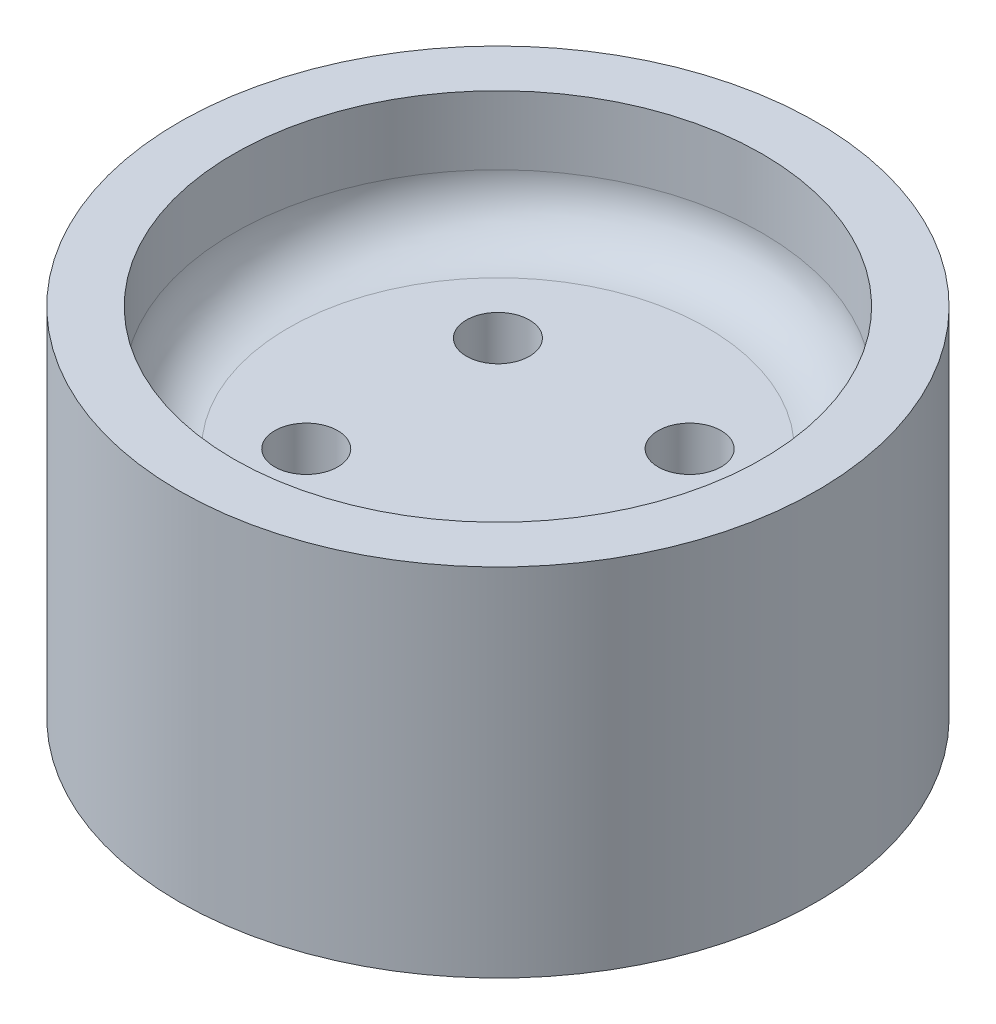
ISO-10303-21;
HEADER;
FILE_DESCRIPTION(('STEP AP214'),'2;1');
FILE_NAME('part.step','',(''),(''),'','','');
FILE_SCHEMA(('AUTOMOTIVE_DESIGN { 1 0 10303 214 1 1 1 1 }'));
ENDSEC;
DATA;
#1=APPLICATION_CONTEXT('core data for automotive mechanical design processes');
#2=APPLICATION_PROTOCOL_DEFINITION('international standard','automotive_design',2000,#1);
#3=PRODUCT_CONTEXT('',#1,'mechanical');
#4=PRODUCT('Part','Part','',(#3));
#5=PRODUCT_RELATED_PRODUCT_CATEGORY('part','',(#4));
#6=PRODUCT_DEFINITION_FORMATION('','',#4);
#7=PRODUCT_DEFINITION_CONTEXT('part definition',#1,'design');
#8=PRODUCT_DEFINITION('design','',#6,#7);
#9=PRODUCT_DEFINITION_SHAPE('','',#8);
#10=(LENGTH_UNIT() NAMED_UNIT(*) SI_UNIT(.MILLI.,.METRE.));
#11=(NAMED_UNIT(*) PLANE_ANGLE_UNIT() SI_UNIT($,.RADIAN.));
#12=(NAMED_UNIT(*) SI_UNIT($,.STERADIAN.) SOLID_ANGLE_UNIT());
#13=UNCERTAINTY_MEASURE_WITH_UNIT(LENGTH_MEASURE(1.E-05),#10,'distance_accuracy_value','');
#14=(GEOMETRIC_REPRESENTATION_CONTEXT(3) GLOBAL_UNCERTAINTY_ASSIGNED_CONTEXT((#13)) GLOBAL_UNIT_ASSIGNED_CONTEXT((#10,
#11,#12)) REPRESENTATION_CONTEXT('',''));
#15=CARTESIAN_POINT('',(0.,0.,0.));
#16=DIRECTION('',(0.,0.,1.));
#17=DIRECTION('',(1.,0.,0.));
#18=AXIS2_PLACEMENT_3D('',#15,#16,#17);
#19=CARTESIAN_POINT('',(0.,8.5,0.));
#20=DIRECTION('',(0.,1.,0.));
#21=DIRECTION('',(0.,0.,1.));
#22=AXIS2_PLACEMENT_3D('',#19,#20,#21);
#23=PLANE('',#22);
#24=CARTESIAN_POINT('',(0.,8.5,0.));
#25=DIRECTION('',(0.,1.,0.));
#26=DIRECTION('',(0.,0.,1.));
#27=AXIS2_PLACEMENT_3D('',#24,#25,#26);
#28=CIRCLE('',#27,7.65);
#29=CARTESIAN_POINT('',(0.,8.5,7.65));
#30=VERTEX_POINT('',#29);
#31=EDGE_CURVE('E10',#30,#30,#28,.T.);
#32=ORIENTED_EDGE('',*,*,#31,.T.);
#33=EDGE_LOOP('',(#32));
#34=FACE_BOUND('',#33,.T.);
#35=CARTESIAN_POINT('',(-3.4999999999998,8.5,3.5));
#36=DIRECTION('',(0.,1.,0.));
#37=DIRECTION('',(0.,0.,1.));
#38=AXIS2_PLACEMENT_3D('',#35,#36,#37);
#39=CIRCLE('',#38,1.1500000000001);
#40=CARTESIAN_POINT('',(-3.4999999999998,8.5,4.6500000000001));
#41=VERTEX_POINT('',#40);
#42=EDGE_CURVE('E45',#41,#41,#39,.T.);
#43=ORIENTED_EDGE('',*,*,#42,.F.);
#44=EDGE_LOOP('',(#43));
#45=FACE_BOUND('',#44,.T.);
#46=CARTESIAN_POINT('',(3.5000000000002,8.5,3.4999999999998));
#47=DIRECTION('',(0.,1.,0.));
#48=DIRECTION('',(0.,0.,1.));
#49=AXIS2_PLACEMENT_3D('',#46,#47,#48);
#50=CIRCLE('',#49,1.15000000000028);
#51=CARTESIAN_POINT('',(3.5000000000002,8.5,4.65000000000008));
#52=VERTEX_POINT('',#51);
#53=EDGE_CURVE('E49',#52,#52,#50,.T.);
#54=ORIENTED_EDGE('',*,*,#53,.F.);
#55=EDGE_LOOP('',(#54));
#56=FACE_BOUND('',#55,.T.);
#57=CARTESIAN_POINT('',(3.5,8.5,-3.5000000000002));
#58=DIRECTION('',(0.,1.,0.));
#59=DIRECTION('',(0.,0.,1.));
#60=AXIS2_PLACEMENT_3D('',#57,#58,#59);
#61=CIRCLE('',#60,1.1500000000002);
#62=CARTESIAN_POINT('',(3.5,8.5,-2.34999999999999));
#63=VERTEX_POINT('',#62);
#64=EDGE_CURVE('E71',#63,#63,#61,.T.);
#65=ORIENTED_EDGE('',*,*,#64,.F.);
#66=EDGE_LOOP('',(#65));
#67=FACE_BOUND('',#66,.T.);
#68=CARTESIAN_POINT('',(-3.5,8.5,-3.5));
#69=DIRECTION('',(0.,1.,0.));
#70=DIRECTION('',(0.,0.,1.));
#71=AXIS2_PLACEMENT_3D('',#68,#69,#70);
#72=CIRCLE('',#71,1.15);
#73=CARTESIAN_POINT('',(-3.5,8.5,-2.35));
#74=VERTEX_POINT('',#73);
#75=EDGE_CURVE('E55',#74,#74,#72,.T.);
#76=ORIENTED_EDGE('',*,*,#75,.F.);
#77=EDGE_LOOP('',(#76));
#78=FACE_BOUND('',#77,.T.);
#79=ADVANCED_FACE('F34',(#34,#45,#56,#67,#78),#23,.T.);
#80=CARTESIAN_POINT('',(-3.4999999999998,8.5,3.5));
#81=DIRECTION('',(0.,-1.,0.));
#82=DIRECTION('',(0.,0.,-1.));
#83=AXIS2_PLACEMENT_3D('',#80,#81,#82);
#84=CYLINDRICAL_SURFACE('',#83,1.1500000000001);
#85=ORIENTED_EDGE('',*,*,#42,.T.);
#86=EDGE_LOOP('',(#85));
#87=FACE_BOUND('',#86,.T.);
#88=CARTESIAN_POINT('',(-3.4999999999998,0.,3.5));
#89=DIRECTION('',(0.,1.,0.));
#90=DIRECTION('',(0.,0.,1.));
#91=AXIS2_PLACEMENT_3D('',#88,#89,#90);
#92=CIRCLE('',#91,1.1500000000001);
#93=CARTESIAN_POINT('',(-3.4999999999998,0.,4.6500000000001));
#94=VERTEX_POINT('',#93);
#95=EDGE_CURVE('E56',#94,#94,#92,.T.);
#96=ORIENTED_EDGE('',*,*,#95,.F.);
#97=EDGE_LOOP('',(#96));
#98=FACE_BOUND('',#97,.T.);
#99=ADVANCED_FACE('F99',(#87,#98),#84,.F.);
#100=CARTESIAN_POINT('',(3.5000000000002,8.5,3.4999999999998));
#101=DIRECTION('',(0.,-1.,0.));
#102=DIRECTION('',(0.,0.,-1.));
#103=AXIS2_PLACEMENT_3D('',#100,#101,#102);
#104=CYLINDRICAL_SURFACE('',#103,1.15000000000028);
#105=ORIENTED_EDGE('',*,*,#53,.T.);
#106=EDGE_LOOP('',(#105));
#107=FACE_BOUND('',#106,.T.);
#108=CARTESIAN_POINT('',(3.5000000000002,0.,3.4999999999998));
#109=DIRECTION('',(0.,1.,0.));
#110=DIRECTION('',(0.,0.,1.));
#111=AXIS2_PLACEMENT_3D('',#108,#109,#110);
#112=CIRCLE('',#111,1.15000000000028);
#113=CARTESIAN_POINT('',(3.5000000000002,0.,4.65000000000008));
#114=VERTEX_POINT('',#113);
#115=EDGE_CURVE('E59',#114,#114,#112,.T.);
#116=ORIENTED_EDGE('',*,*,#115,.F.);
#117=EDGE_LOOP('',(#116));
#118=FACE_BOUND('',#117,.T.);
#119=ADVANCED_FACE('F103',(#107,#118),#104,.F.);
#120=CARTESIAN_POINT('',(3.5,8.5,-3.5000000000002));
#121=DIRECTION('',(0.,-1.,0.));
#122=DIRECTION('',(0.,0.,-1.));
#123=AXIS2_PLACEMENT_3D('',#120,#121,#122);
#124=CYLINDRICAL_SURFACE('',#123,1.1500000000002);
#125=ORIENTED_EDGE('',*,*,#64,.T.);
#126=EDGE_LOOP('',(#125));
#127=FACE_BOUND('',#126,.T.);
#128=CARTESIAN_POINT('',(3.5,0.,-3.5000000000002));
#129=DIRECTION('',(0.,1.,0.));
#130=DIRECTION('',(0.,0.,1.));
#131=AXIS2_PLACEMENT_3D('',#128,#129,#130);
#132=CIRCLE('',#131,1.1500000000002);
#133=CARTESIAN_POINT('',(3.5,0.,-2.34999999999999));
#134=VERTEX_POINT('',#133);
#135=EDGE_CURVE('E62',#134,#134,#132,.T.);
#136=ORIENTED_EDGE('',*,*,#135,.F.);
#137=EDGE_LOOP('',(#136));
#138=FACE_BOUND('',#137,.T.);
#139=ADVANCED_FACE('F114',(#127,#138),#124,.F.);
#140=CARTESIAN_POINT('',(-3.5,8.5,-3.5));
#141=DIRECTION('',(0.,-1.,0.));
#142=DIRECTION('',(0.,0.,-1.));
#143=AXIS2_PLACEMENT_3D('',#140,#141,#142);
#144=CYLINDRICAL_SURFACE('',#143,1.15);
#145=ORIENTED_EDGE('',*,*,#75,.T.);
#146=EDGE_LOOP('',(#145));
#147=FACE_BOUND('',#146,.T.);
#148=CARTESIAN_POINT('',(-3.5,0.,-3.5));
#149=DIRECTION('',(0.,1.,0.));
#150=DIRECTION('',(0.,0.,1.));
#151=AXIS2_PLACEMENT_3D('',#148,#149,#150);
#152=CIRCLE('',#151,1.15);
#153=CARTESIAN_POINT('',(-3.5,0.,-2.35));
#154=VERTEX_POINT('',#153);
#155=EDGE_CURVE('E65',#154,#154,#152,.T.);
#156=ORIENTED_EDGE('',*,*,#155,.F.);
#157=EDGE_LOOP('',(#156));
#158=FACE_BOUND('',#157,.T.);
#159=ADVANCED_FACE('F109',(#147,#158),#144,.F.);
#160=CARTESIAN_POINT('',(0.,8.5,0.));
#161=DIRECTION('',(0.,-1.,0.));
#162=DIRECTION('',(0.,0.,-1.));
#163=AXIS2_PLACEMENT_3D('',#160,#161,#162);
#164=CYLINDRICAL_SURFACE('',#163,11.65);
#165=CARTESIAN_POINT('',(0.,0.,0.));
#166=DIRECTION('',(0.,1.,0.));
#167=DIRECTION('',(0.,0.,1.));
#168=AXIS2_PLACEMENT_3D('',#165,#166,#167);
#169=CIRCLE('',#168,11.65);
#170=CARTESIAN_POINT('',(0.,0.,11.65));
#171=VERTEX_POINT('',#170);
#172=EDGE_CURVE('E52',#171,#171,#169,.T.);
#173=ORIENTED_EDGE('',*,*,#172,.T.);
#174=EDGE_LOOP('',(#173));
#175=FACE_BOUND('',#174,.T.);
#176=CARTESIAN_POINT('',(0.,13.,0.));
#177=DIRECTION('',(0.,1.,0.));
#178=DIRECTION('',(0.,0.,1.));
#179=AXIS2_PLACEMENT_3D('',#176,#177,#178);
#180=CIRCLE('',#179,11.65);
#181=CARTESIAN_POINT('',(0.,13.,11.65));
#182=VERTEX_POINT('',#181);
#183=EDGE_CURVE('E67',#182,#182,#180,.T.);
#184=ORIENTED_EDGE('',*,*,#183,.F.);
#185=EDGE_LOOP('',(#184));
#186=FACE_BOUND('',#185,.T.);
#187=ADVANCED_FACE('F94',(#175,#186),#164,.T.);
#188=CARTESIAN_POINT('',(0.,0.,0.));
#189=DIRECTION('',(0.,1.,0.));
#190=DIRECTION('',(0.,0.,1.));
#191=AXIS2_PLACEMENT_3D('',#188,#189,#190);
#192=PLANE('',#191);
#193=ORIENTED_EDGE('',*,*,#155,.T.);
#194=EDGE_LOOP('',(#193));
#195=FACE_BOUND('',#194,.T.);
#196=ORIENTED_EDGE('',*,*,#135,.T.);
#197=EDGE_LOOP('',(#196));
#198=FACE_BOUND('',#197,.T.);
#199=ORIENTED_EDGE('',*,*,#115,.T.);
#200=EDGE_LOOP('',(#199));
#201=FACE_BOUND('',#200,.T.);
#202=ORIENTED_EDGE('',*,*,#95,.T.);
#203=EDGE_LOOP('',(#202));
#204=FACE_BOUND('',#203,.T.);
#205=ORIENTED_EDGE('',*,*,#172,.F.);
#206=EDGE_LOOP('',(#205));
#207=FACE_BOUND('',#206,.T.);
#208=ADVANCED_FACE('F86',(#195,#198,#201,#204,#207),#192,.F.);
#209=CARTESIAN_POINT('',(0.,13.,0.));
#210=DIRECTION('',(0.,1.,0.));
#211=DIRECTION('',(0.,0.,1.));
#212=AXIS2_PLACEMENT_3D('',#209,#210,#211);
#213=PLANE('',#212);
#214=ORIENTED_EDGE('',*,*,#183,.T.);
#215=EDGE_LOOP('',(#214));
#216=FACE_BOUND('',#215,.T.);
#217=CARTESIAN_POINT('',(0.,13.,0.));
#218=DIRECTION('',(0.,1.,0.));
#219=DIRECTION('',(0.,0.,1.));
#220=AXIS2_PLACEMENT_3D('',#217,#218,#219);
#221=CIRCLE('',#220,9.65);
#222=CARTESIAN_POINT('',(0.,13.,9.65));
#223=VERTEX_POINT('',#222);
#224=EDGE_CURVE('E78',#223,#223,#221,.T.);
#225=ORIENTED_EDGE('',*,*,#224,.F.);
#226=EDGE_LOOP('',(#225));
#227=FACE_BOUND('',#226,.T.);
#228=ADVANCED_FACE('F84',(#216,#227),#213,.T.);
#229=CARTESIAN_POINT('',(0.,13.,0.));
#230=DIRECTION('',(0.,-1.,0.));
#231=DIRECTION('',(0.,0.,-1.));
#232=AXIS2_PLACEMENT_3D('',#229,#230,#231);
#233=CYLINDRICAL_SURFACE('',#232,9.65);
#234=CARTESIAN_POINT('',(0.,10.5,0.));
#235=DIRECTION('',(0.,1.,0.));
#236=DIRECTION('',(0.,0.,1.));
#237=AXIS2_PLACEMENT_3D('',#234,#235,#236);
#238=CIRCLE('',#237,9.65);
#239=CARTESIAN_POINT('',(0.,10.5,9.65));
#240=VERTEX_POINT('',#239);
#241=EDGE_CURVE('E41',#240,#240,#238,.F.);
#242=ORIENTED_EDGE('',*,*,#241,.T.);
#243=EDGE_LOOP('',(#242));
#244=FACE_BOUND('',#243,.T.);
#245=ORIENTED_EDGE('',*,*,#224,.T.);
#246=EDGE_LOOP('',(#245));
#247=FACE_BOUND('',#246,.T.);
#248=ADVANCED_FACE('F82',(#244,#247),#233,.F.);
#249=CARTESIAN_POINT('',(0.,10.5,0.));
#250=DIRECTION('',(0.,1.,0.));
#251=DIRECTION('',(0.,0.,1.));
#252=AXIS2_PLACEMENT_3D('',#249,#250,#251);
#253=TOROIDAL_SURFACE('',#252,7.65,2.);
#254=ORIENTED_EDGE('',*,*,#31,.F.);
#255=EDGE_LOOP('',(#254));
#256=FACE_BOUND('',#255,.T.);
#257=ORIENTED_EDGE('',*,*,#241,.F.);
#258=EDGE_LOOP('',(#257));
#259=FACE_BOUND('',#258,.T.);
#260=ADVANCED_FACE('F36',(#256,#259),#253,.F.);
#261=CLOSED_SHELL('',(#79,#99,#119,#139,#159,#187,#208,#228,#248,#260));
#262=MANIFOLD_SOLID_BREP('B2',#261);
#263=ADVANCED_BREP_SHAPE_REPRESENTATION('',(#18,#262),#14);
#264=SHAPE_DEFINITION_REPRESENTATION(#9,#263);
ENDSEC;
END-ISO-10303-21;
